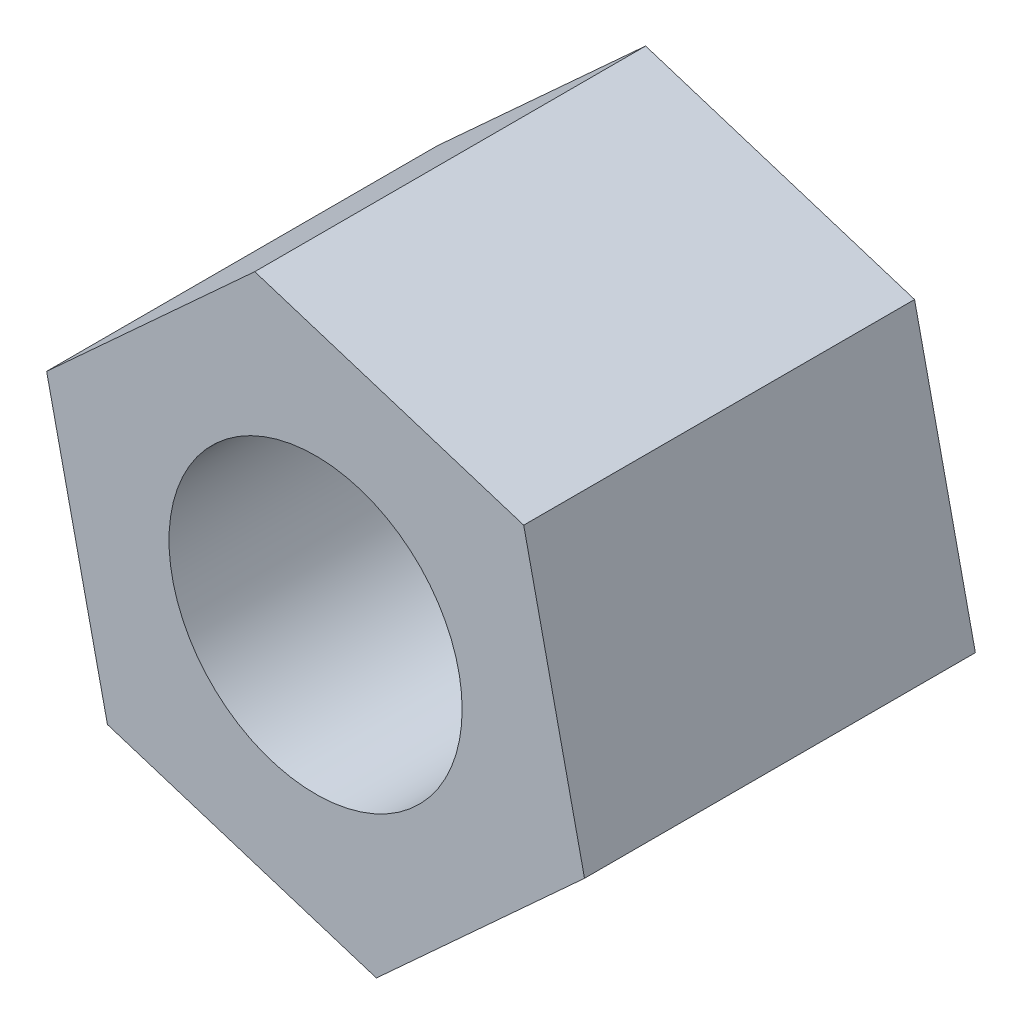
ISO-10303-21;
HEADER;
FILE_DESCRIPTION(('STEP AP214'),'2;1');
FILE_NAME('part.step','',(''),(''),'','','');
FILE_SCHEMA(('AUTOMOTIVE_DESIGN { 1 0 10303 214 1 1 1 1 }'));
ENDSEC;
DATA;
#1=APPLICATION_CONTEXT('core data for automotive mechanical design processes');
#2=APPLICATION_PROTOCOL_DEFINITION('international standard','automotive_design',2000,#1);
#3=PRODUCT_CONTEXT('',#1,'mechanical');
#4=PRODUCT('Part','Part','',(#3));
#5=PRODUCT_RELATED_PRODUCT_CATEGORY('part','',(#4));
#6=PRODUCT_DEFINITION_FORMATION('','',#4);
#7=PRODUCT_DEFINITION_CONTEXT('part definition',#1,'design');
#8=PRODUCT_DEFINITION('design','',#6,#7);
#9=PRODUCT_DEFINITION_SHAPE('','',#8);
#10=(LENGTH_UNIT() NAMED_UNIT(*) SI_UNIT(.MILLI.,.METRE.));
#11=(NAMED_UNIT(*) PLANE_ANGLE_UNIT() SI_UNIT($,.RADIAN.));
#12=(NAMED_UNIT(*) SI_UNIT($,.STERADIAN.) SOLID_ANGLE_UNIT());
#13=UNCERTAINTY_MEASURE_WITH_UNIT(LENGTH_MEASURE(1.E-05),#10,'distance_accuracy_value','');
#14=(GEOMETRIC_REPRESENTATION_CONTEXT(3) GLOBAL_UNCERTAINTY_ASSIGNED_CONTEXT((#13)) GLOBAL_UNIT_ASSIGNED_CONTEXT((#10,
#11,#12)) REPRESENTATION_CONTEXT('',''));
#15=CARTESIAN_POINT('',(0.,0.,0.));
#16=DIRECTION('',(0.,0.,1.));
#17=DIRECTION('',(1.,0.,0.));
#18=AXIS2_PLACEMENT_3D('',#15,#16,#17);
#19=CARTESIAN_POINT('',(0.,0.,4.));
#20=DIRECTION('',(0.,0.,1.));
#21=DIRECTION('',(1.,0.,0.));
#22=AXIS2_PLACEMENT_3D('',#19,#20,#21);
#23=PLANE('',#22);
#24=DIRECTION('',(-0.953454153940181,0.301538018057779,0.));
#25=VECTOR('',#24,1.);
#26=CARTESIAN_POINT('',(2.13003757623777,1.94840274510904,4.));
#27=LINE('',#26,#25);
#28=CARTESIAN_POINT('',(2.13003757623777,1.94840274510904,4.));
#29=VERTEX_POINT('',#28);
#30=CARTESIAN_POINT('',(-0.622347485948877,2.81886802459187,4.));
#31=VERTEX_POINT('',#30);
#32=EDGE_CURVE('E146',#29,#31,#27,.T.);
#33=ORIENTED_EDGE('',*,*,#32,.T.);
#34=DIRECTION('',(-0.737866660814938,-0.674946509627106,0.));
#35=VECTOR('',#34,1.);
#36=CARTESIAN_POINT('',(-0.622347485948877,2.81886802459187,4.));
#37=LINE('',#36,#35);
#38=CARTESIAN_POINT('',(-2.75238506218665,0.870465279482826,4.));
#39=VERTEX_POINT('',#38);
#40=EDGE_CURVE('E94',#31,#39,#37,.T.);
#41=ORIENTED_EDGE('',*,*,#40,.T.);
#42=DIRECTION('',(0.215587493125243,-0.976484527684885,0.));
#43=VECTOR('',#42,1.);
#44=CARTESIAN_POINT('',(-2.75238506218665,0.870465279482826,4.));
#45=LINE('',#44,#43);
#46=CARTESIAN_POINT('',(-2.13003757623777,-1.94840274510904,4.));
#47=VERTEX_POINT('',#46);
#48=EDGE_CURVE('E107',#39,#47,#45,.T.);
#49=ORIENTED_EDGE('',*,*,#48,.T.);
#50=DIRECTION('',(0.953454153940181,-0.301538018057779,0.));
#51=VECTOR('',#50,1.);
#52=CARTESIAN_POINT('',(-2.13003757623777,-1.94840274510904,4.));
#53=LINE('',#52,#51);
#54=CARTESIAN_POINT('',(0.622347485948878,-2.81886802459186,4.));
#55=VERTEX_POINT('',#54);
#56=EDGE_CURVE('E101',#47,#55,#53,.T.);
#57=ORIENTED_EDGE('',*,*,#56,.T.);
#58=DIRECTION('',(0.737866660814938,0.674946509627106,0.));
#59=VECTOR('',#58,1.);
#60=CARTESIAN_POINT('',(0.622347485948878,-2.81886802459186,4.));
#61=LINE('',#60,#59);
#62=CARTESIAN_POINT('',(2.75238506218665,-0.870465279482826,4.));
#63=VERTEX_POINT('',#62);
#64=EDGE_CURVE('E105',#55,#63,#61,.T.);
#65=ORIENTED_EDGE('',*,*,#64,.T.);
#66=DIRECTION('',(-0.215587493125243,0.976484527684885,0.));
#67=VECTOR('',#66,1.);
#68=CARTESIAN_POINT('',(2.75238506218665,-0.870465279482826,4.));
#69=LINE('',#68,#67);
#70=EDGE_CURVE('E57',#63,#29,#69,.T.);
#71=ORIENTED_EDGE('',*,*,#70,.T.);
#72=EDGE_LOOP('',(#33,#41,#49,#57,#65,#71));
#73=FACE_BOUND('',#72,.T.);
#74=CARTESIAN_POINT('',(0.,0.,4.));
#75=DIRECTION('',(0.,0.,1.));
#76=DIRECTION('',(1.,0.,0.));
#77=AXIS2_PLACEMENT_3D('',#74,#75,#76);
#78=CIRCLE('',#77,1.5);
#79=CARTESIAN_POINT('',(1.5,0.,4.));
#80=VERTEX_POINT('',#79);
#81=EDGE_CURVE('E134',#80,#80,#78,.T.);
#82=ORIENTED_EDGE('',*,*,#81,.F.);
#83=EDGE_LOOP('',(#82));
#84=FACE_BOUND('',#83,.T.);
#85=ADVANCED_FACE('F39',(#73,#84),#23,.T.);
#86=CARTESIAN_POINT('',(0.,0.,0.));
#87=DIRECTION('',(0.,0.,1.));
#88=DIRECTION('',(1.,0.,0.));
#89=AXIS2_PLACEMENT_3D('',#86,#87,#88);
#90=PLANE('',#89);
#91=DIRECTION('',(-0.953454153940181,0.301538018057779,0.));
#92=VECTOR('',#91,1.);
#93=CARTESIAN_POINT('',(2.13003757623777,1.94840274510904,0.));
#94=LINE('',#93,#92);
#95=CARTESIAN_POINT('',(2.13003757623777,1.94840274510904,0.));
#96=VERTEX_POINT('',#95);
#97=CARTESIAN_POINT('',(-0.622347485948877,2.81886802459187,0.));
#98=VERTEX_POINT('',#97);
#99=EDGE_CURVE('E129',#96,#98,#94,.T.);
#100=ORIENTED_EDGE('',*,*,#99,.F.);
#101=DIRECTION('',(-0.215587493125243,0.976484527684885,0.));
#102=VECTOR('',#101,1.);
#103=CARTESIAN_POINT('',(2.75238506218665,-0.870465279482826,0.));
#104=LINE('',#103,#102);
#105=CARTESIAN_POINT('',(2.75238506218665,-0.870465279482826,0.));
#106=VERTEX_POINT('',#105);
#107=EDGE_CURVE('E86',#106,#96,#104,.T.);
#108=ORIENTED_EDGE('',*,*,#107,.F.);
#109=DIRECTION('',(0.737866660814938,0.674946509627106,0.));
#110=VECTOR('',#109,1.);
#111=CARTESIAN_POINT('',(0.622347485948878,-2.81886802459186,0.));
#112=LINE('',#111,#110);
#113=CARTESIAN_POINT('',(0.622347485948878,-2.81886802459186,0.));
#114=VERTEX_POINT('',#113);
#115=EDGE_CURVE('E80',#114,#106,#112,.T.);
#116=ORIENTED_EDGE('',*,*,#115,.F.);
#117=DIRECTION('',(0.953454153940181,-0.301538018057779,0.));
#118=VECTOR('',#117,1.);
#119=CARTESIAN_POINT('',(-2.13003757623777,-1.94840274510904,0.));
#120=LINE('',#119,#118);
#121=CARTESIAN_POINT('',(-2.13003757623777,-1.94840274510904,0.));
#122=VERTEX_POINT('',#121);
#123=EDGE_CURVE('E116',#122,#114,#120,.T.);
#124=ORIENTED_EDGE('',*,*,#123,.F.);
#125=DIRECTION('',(0.215587493125243,-0.976484527684885,0.));
#126=VECTOR('',#125,1.);
#127=CARTESIAN_POINT('',(-2.75238506218665,0.870465279482826,0.));
#128=LINE('',#127,#126);
#129=CARTESIAN_POINT('',(-2.75238506218665,0.870465279482826,0.));
#130=VERTEX_POINT('',#129);
#131=EDGE_CURVE('E137',#130,#122,#128,.T.);
#132=ORIENTED_EDGE('',*,*,#131,.F.);
#133=DIRECTION('',(-0.737866660814938,-0.674946509627106,0.));
#134=VECTOR('',#133,1.);
#135=CARTESIAN_POINT('',(-0.622347485948877,2.81886802459187,0.));
#136=LINE('',#135,#134);
#137=EDGE_CURVE('E133',#98,#130,#136,.T.);
#138=ORIENTED_EDGE('',*,*,#137,.F.);
#139=EDGE_LOOP('',(#100,#108,#116,#124,#132,#138));
#140=FACE_BOUND('',#139,.T.);
#141=CARTESIAN_POINT('',(0.,0.,0.));
#142=DIRECTION('',(0.,0.,1.));
#143=DIRECTION('',(1.,0.,0.));
#144=AXIS2_PLACEMENT_3D('',#141,#142,#143);
#145=CIRCLE('',#144,1.5);
#146=CARTESIAN_POINT('',(1.5,0.,0.));
#147=VERTEX_POINT('',#146);
#148=EDGE_CURVE('E243',#147,#147,#145,.T.);
#149=ORIENTED_EDGE('',*,*,#148,.T.);
#150=EDGE_LOOP('',(#149));
#151=FACE_BOUND('',#150,.T.);
#152=ADVANCED_FACE('F159',(#140,#151),#90,.F.);
#153=CARTESIAN_POINT('',(2.13003757623777,1.94840274510904,4.));
#154=DIRECTION('',(-0.301538018057779,-0.953454153940181,0.));
#155=DIRECTION('',(0.953454153940181,-0.301538018057779,0.));
#156=AXIS2_PLACEMENT_3D('',#153,#154,#155);
#157=PLANE('',#156);
#158=ORIENTED_EDGE('',*,*,#99,.T.);
#159=DIRECTION('',(0.,0.,-1.));
#160=VECTOR('',#159,1.);
#161=CARTESIAN_POINT('',(-0.622347485948877,2.81886802459187,4.));
#162=LINE('',#161,#160);
#163=EDGE_CURVE('E11',#31,#98,#162,.T.);
#164=ORIENTED_EDGE('',*,*,#163,.F.);
#165=ORIENTED_EDGE('',*,*,#32,.F.);
#166=DIRECTION('',(0.,0.,-1.));
#167=VECTOR('',#166,1.);
#168=CARTESIAN_POINT('',(2.13003757623777,1.94840274510904,4.));
#169=LINE('',#168,#167);
#170=EDGE_CURVE('E125',#29,#96,#169,.T.);
#171=ORIENTED_EDGE('',*,*,#170,.T.);
#172=EDGE_LOOP('',(#158,#164,#165,#171));
#173=FACE_BOUND('',#172,.T.);
#174=ADVANCED_FACE('F41',(#173),#157,.F.);
#175=CARTESIAN_POINT('',(-0.622347485948877,2.81886802459187,4.));
#176=DIRECTION('',(0.674946509627106,-0.737866660814938,0.));
#177=DIRECTION('',(0.737866660814938,0.674946509627106,0.));
#178=AXIS2_PLACEMENT_3D('',#175,#176,#177);
#179=PLANE('',#178);
#180=ORIENTED_EDGE('',*,*,#137,.T.);
#181=DIRECTION('',(0.,0.,-1.));
#182=VECTOR('',#181,1.);
#183=CARTESIAN_POINT('',(-2.75238506218665,0.870465279482826,4.));
#184=LINE('',#183,#182);
#185=EDGE_CURVE('E49',#39,#130,#184,.T.);
#186=ORIENTED_EDGE('',*,*,#185,.F.);
#187=ORIENTED_EDGE('',*,*,#40,.F.);
#188=ORIENTED_EDGE('',*,*,#163,.T.);
#189=EDGE_LOOP('',(#180,#186,#187,#188));
#190=FACE_BOUND('',#189,.T.);
#191=ADVANCED_FACE('F184',(#190),#179,.F.);
#192=CARTESIAN_POINT('',(-2.75238506218665,0.870465279482826,4.));
#193=DIRECTION('',(0.976484527684885,0.215587493125243,0.));
#194=DIRECTION('',(-0.215587493125243,0.976484527684885,0.));
#195=AXIS2_PLACEMENT_3D('',#192,#193,#194);
#196=PLANE('',#195);
#197=ORIENTED_EDGE('',*,*,#131,.T.);
#198=DIRECTION('',(0.,0.,-1.));
#199=VECTOR('',#198,1.);
#200=CARTESIAN_POINT('',(-2.13003757623777,-1.94840274510904,4.));
#201=LINE('',#200,#199);
#202=EDGE_CURVE('E118',#47,#122,#201,.T.);
#203=ORIENTED_EDGE('',*,*,#202,.F.);
#204=ORIENTED_EDGE('',*,*,#48,.F.);
#205=ORIENTED_EDGE('',*,*,#185,.T.);
#206=EDGE_LOOP('',(#197,#203,#204,#205));
#207=FACE_BOUND('',#206,.T.);
#208=ADVANCED_FACE('F156',(#207),#196,.F.);
#209=CARTESIAN_POINT('',(-2.13003757623777,-1.94840274510904,4.));
#210=DIRECTION('',(0.301538018057779,0.953454153940181,0.));
#211=DIRECTION('',(-0.953454153940181,0.301538018057779,0.));
#212=AXIS2_PLACEMENT_3D('',#209,#210,#211);
#213=PLANE('',#212);
#214=ORIENTED_EDGE('',*,*,#123,.T.);
#215=DIRECTION('',(0.,0.,-1.));
#216=VECTOR('',#215,1.);
#217=CARTESIAN_POINT('',(0.622347485948878,-2.81886802459186,4.));
#218=LINE('',#217,#216);
#219=EDGE_CURVE('E113',#55,#114,#218,.T.);
#220=ORIENTED_EDGE('',*,*,#219,.F.);
#221=ORIENTED_EDGE('',*,*,#56,.F.);
#222=ORIENTED_EDGE('',*,*,#202,.T.);
#223=EDGE_LOOP('',(#214,#220,#221,#222));
#224=FACE_BOUND('',#223,.T.);
#225=ADVANCED_FACE('F114',(#224),#213,.F.);
#226=CARTESIAN_POINT('',(0.622347485948878,-2.81886802459186,4.));
#227=DIRECTION('',(-0.674946509627106,0.737866660814938,0.));
#228=DIRECTION('',(-0.737866660814938,-0.674946509627106,0.));
#229=AXIS2_PLACEMENT_3D('',#226,#227,#228);
#230=PLANE('',#229);
#231=ORIENTED_EDGE('',*,*,#115,.T.);
#232=DIRECTION('',(0.,0.,-1.));
#233=VECTOR('',#232,1.);
#234=CARTESIAN_POINT('',(2.75238506218665,-0.870465279482826,4.));
#235=LINE('',#234,#233);
#236=EDGE_CURVE('E119',#63,#106,#235,.T.);
#237=ORIENTED_EDGE('',*,*,#236,.F.);
#238=ORIENTED_EDGE('',*,*,#64,.F.);
#239=ORIENTED_EDGE('',*,*,#219,.T.);
#240=EDGE_LOOP('',(#231,#237,#238,#239));
#241=FACE_BOUND('',#240,.T.);
#242=ADVANCED_FACE('F121',(#241),#230,.F.);
#243=CARTESIAN_POINT('',(2.75238506218665,-0.870465279482826,4.));
#244=DIRECTION('',(-0.976484527684885,-0.215587493125243,0.));
#245=DIRECTION('',(0.215587493125243,-0.976484527684885,0.));
#246=AXIS2_PLACEMENT_3D('',#243,#244,#245);
#247=PLANE('',#246);
#248=ORIENTED_EDGE('',*,*,#107,.T.);
#249=ORIENTED_EDGE('',*,*,#170,.F.);
#250=ORIENTED_EDGE('',*,*,#70,.F.);
#251=ORIENTED_EDGE('',*,*,#236,.T.);
#252=EDGE_LOOP('',(#248,#249,#250,#251));
#253=FACE_BOUND('',#252,.T.);
#254=ADVANCED_FACE('F164',(#253),#247,.F.);
#255=CARTESIAN_POINT('',(0.,0.,4.));
#256=DIRECTION('',(0.,0.,-1.));
#257=DIRECTION('',(-1.,0.,0.));
#258=AXIS2_PLACEMENT_3D('',#255,#256,#257);
#259=CYLINDRICAL_SURFACE('',#258,1.5);
#260=ORIENTED_EDGE('',*,*,#81,.T.);
#261=EDGE_LOOP('',(#260));
#262=FACE_BOUND('',#261,.T.);
#263=ORIENTED_EDGE('',*,*,#148,.F.);
#264=EDGE_LOOP('',(#263));
#265=FACE_BOUND('',#264,.T.);
#266=ADVANCED_FACE('F166',(#262,#265),#259,.F.);
#267=CLOSED_SHELL('',(#85,#152,#174,#191,#208,#225,#242,#254,#266));
#268=MANIFOLD_SOLID_BREP('B2',#267);
#269=ADVANCED_BREP_SHAPE_REPRESENTATION('',(#18,#268),#14);
#270=SHAPE_DEFINITION_REPRESENTATION(#9,#269);
ENDSEC;
END-ISO-10303-21;
